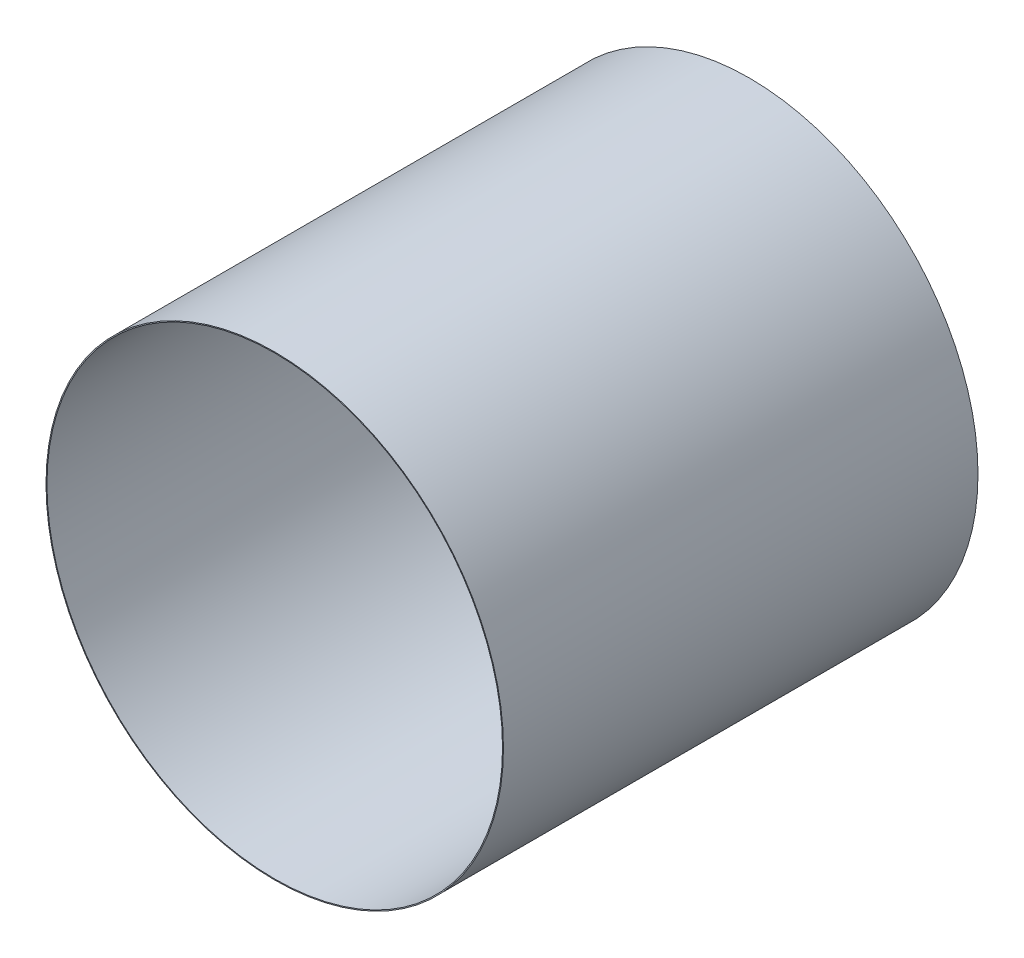
ISO-10303-21;
HEADER;
FILE_DESCRIPTION(('STEP AP214'),'2;1');
FILE_NAME('part.step','',(''),(''),'','','');
FILE_SCHEMA(('AUTOMOTIVE_DESIGN { 1 0 10303 214 1 1 1 1 }'));
ENDSEC;
DATA;
#1=APPLICATION_CONTEXT('core data for automotive mechanical design processes');
#2=APPLICATION_PROTOCOL_DEFINITION('international standard','automotive_design',2000,#1);
#3=PRODUCT_CONTEXT('',#1,'mechanical');
#4=PRODUCT('Part','Part','',(#3));
#5=PRODUCT_RELATED_PRODUCT_CATEGORY('part','',(#4));
#6=PRODUCT_DEFINITION_FORMATION('','',#4);
#7=PRODUCT_DEFINITION_CONTEXT('part definition',#1,'design');
#8=PRODUCT_DEFINITION('design','',#6,#7);
#9=PRODUCT_DEFINITION_SHAPE('','',#8);
#10=(LENGTH_UNIT() NAMED_UNIT(*) SI_UNIT(.MILLI.,.METRE.));
#11=(NAMED_UNIT(*) PLANE_ANGLE_UNIT() SI_UNIT($,.RADIAN.));
#12=(NAMED_UNIT(*) SI_UNIT($,.STERADIAN.) SOLID_ANGLE_UNIT());
#13=UNCERTAINTY_MEASURE_WITH_UNIT(LENGTH_MEASURE(1.E-05),#10,'distance_accuracy_value','');
#14=(GEOMETRIC_REPRESENTATION_CONTEXT(3) GLOBAL_UNCERTAINTY_ASSIGNED_CONTEXT((#13)) GLOBAL_UNIT_ASSIGNED_CONTEXT((#10,
#11,#12)) REPRESENTATION_CONTEXT('',''));
#15=CARTESIAN_POINT('',(0.,0.,0.));
#16=DIRECTION('',(0.,0.,1.));
#17=DIRECTION('',(1.,0.,0.));
#18=AXIS2_PLACEMENT_3D('',#15,#16,#17);
#19=CARTESIAN_POINT('',(0.,0.,25.));
#20=DIRECTION('',(0.,0.,1.));
#21=DIRECTION('',(1.,0.,0.));
#22=AXIS2_PLACEMENT_3D('',#19,#20,#21);
#23=PLANE('',#22);
#24=CARTESIAN_POINT('',(0.,0.,25.));
#25=DIRECTION('',(0.,0.,1.));
#26=DIRECTION('',(1.,0.,0.));
#27=AXIS2_PLACEMENT_3D('',#24,#25,#26);
#28=CIRCLE('',#27,12.05);
#29=CARTESIAN_POINT('',(12.05,0.,25.));
#30=VERTEX_POINT('',#29);
#31=EDGE_CURVE('E10',#30,#30,#28,.T.);
#32=ORIENTED_EDGE('',*,*,#31,.T.);
#33=EDGE_LOOP('',(#32));
#34=FACE_BOUND('',#33,.T.);
#35=CARTESIAN_POINT('',(0.,0.,25.));
#36=DIRECTION('',(0.,0.,1.));
#37=DIRECTION('',(1.,0.,0.));
#38=AXIS2_PLACEMENT_3D('',#35,#36,#37);
#39=CIRCLE('',#38,12.);
#40=CARTESIAN_POINT('',(12.,0.,25.));
#41=VERTEX_POINT('',#40);
#42=EDGE_CURVE('E42',#41,#41,#39,.T.);
#43=ORIENTED_EDGE('',*,*,#42,.F.);
#44=EDGE_LOOP('',(#43));
#45=FACE_BOUND('',#44,.T.);
#46=ADVANCED_FACE('F31',(#34,#45),#23,.T.);
#47=CARTESIAN_POINT('',(0.,0.,0.));
#48=DIRECTION('',(0.,0.,1.));
#49=DIRECTION('',(1.,0.,0.));
#50=AXIS2_PLACEMENT_3D('',#47,#48,#49);
#51=PLANE('',#50);
#52=CARTESIAN_POINT('',(0.,0.,0.));
#53=DIRECTION('',(0.,0.,1.));
#54=DIRECTION('',(1.,0.,0.));
#55=AXIS2_PLACEMENT_3D('',#52,#53,#54);
#56=CIRCLE('',#55,12.05);
#57=CARTESIAN_POINT('',(12.05,0.,0.));
#58=VERTEX_POINT('',#57);
#59=EDGE_CURVE('E35',#58,#58,#56,.T.);
#60=ORIENTED_EDGE('',*,*,#59,.F.);
#61=EDGE_LOOP('',(#60));
#62=FACE_BOUND('',#61,.T.);
#63=CARTESIAN_POINT('',(0.,0.,0.));
#64=DIRECTION('',(0.,0.,1.));
#65=DIRECTION('',(1.,0.,0.));
#66=AXIS2_PLACEMENT_3D('',#63,#64,#65);
#67=CIRCLE('',#66,12.);
#68=CARTESIAN_POINT('',(12.,0.,0.));
#69=VERTEX_POINT('',#68);
#70=EDGE_CURVE('E44',#69,#69,#67,.T.);
#71=ORIENTED_EDGE('',*,*,#70,.T.);
#72=EDGE_LOOP('',(#71));
#73=FACE_BOUND('',#72,.T.);
#74=ADVANCED_FACE('F54',(#62,#73),#51,.F.);
#75=CARTESIAN_POINT('',(0.,0.,25.));
#76=DIRECTION('',(0.,0.,-1.));
#77=DIRECTION('',(-1.,0.,0.));
#78=AXIS2_PLACEMENT_3D('',#75,#76,#77);
#79=CYLINDRICAL_SURFACE('',#78,12.05);
#80=ORIENTED_EDGE('',*,*,#31,.F.);
#81=EDGE_LOOP('',(#80));
#82=FACE_BOUND('',#81,.T.);
#83=ORIENTED_EDGE('',*,*,#59,.T.);
#84=EDGE_LOOP('',(#83));
#85=FACE_BOUND('',#84,.T.);
#86=ADVANCED_FACE('F33',(#82,#85),#79,.T.);
#87=CARTESIAN_POINT('',(0.,0.,25.));
#88=DIRECTION('',(0.,0.,-1.));
#89=DIRECTION('',(-1.,0.,0.));
#90=AXIS2_PLACEMENT_3D('',#87,#88,#89);
#91=CYLINDRICAL_SURFACE('',#90,12.);
#92=ORIENTED_EDGE('',*,*,#42,.T.);
#93=EDGE_LOOP('',(#92));
#94=FACE_BOUND('',#93,.T.);
#95=ORIENTED_EDGE('',*,*,#70,.F.);
#96=EDGE_LOOP('',(#95));
#97=FACE_BOUND('',#96,.T.);
#98=ADVANCED_FACE('F50',(#94,#97),#91,.F.);
#99=CLOSED_SHELL('',(#46,#74,#86,#98));
#100=MANIFOLD_SOLID_BREP('B2',#99);
#101=ADVANCED_BREP_SHAPE_REPRESENTATION('',(#18,#100),#14);
#102=SHAPE_DEFINITION_REPRESENTATION(#9,#101);
ENDSEC;
END-ISO-10303-21;
